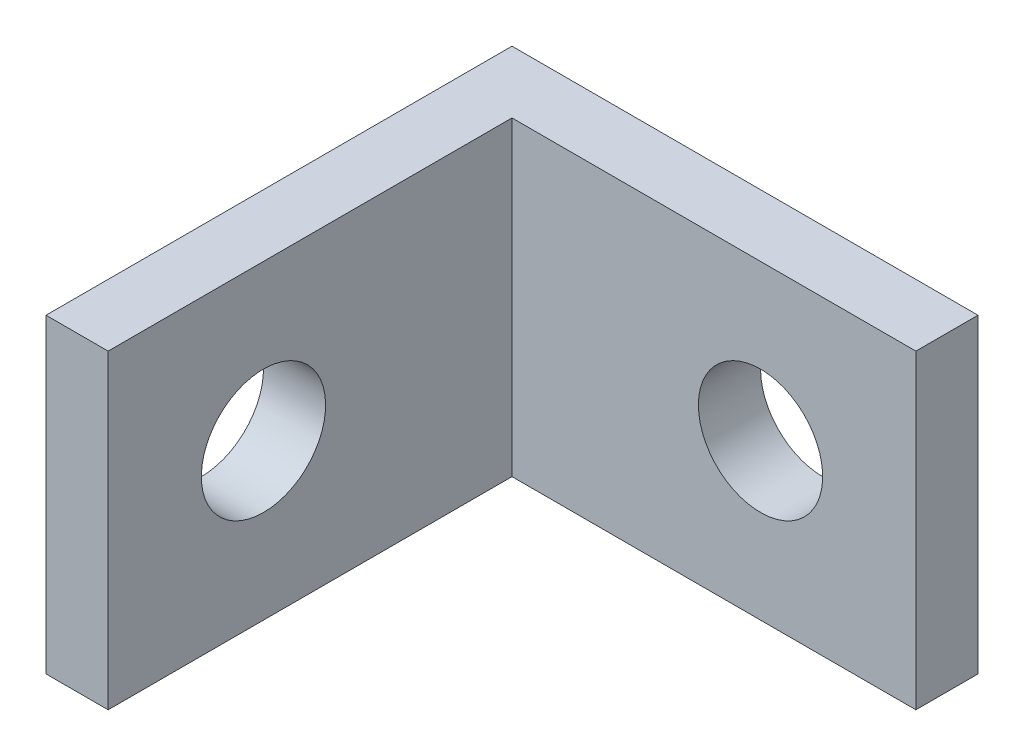
ISO-10303-21;
HEADER;
FILE_DESCRIPTION(('STEP AP214'),'2;1');
FILE_NAME('part.step','',(''),(''),'','','');
FILE_SCHEMA(('AUTOMOTIVE_DESIGN { 1 0 10303 214 1 1 1 1 }'));
ENDSEC;
DATA;
#1=APPLICATION_CONTEXT('core data for automotive mechanical design processes');
#2=APPLICATION_PROTOCOL_DEFINITION('international standard','automotive_design',2000,#1);
#3=PRODUCT_CONTEXT('',#1,'mechanical');
#4=PRODUCT('Part','Part','',(#3));
#5=PRODUCT_RELATED_PRODUCT_CATEGORY('part','',(#4));
#6=PRODUCT_DEFINITION_FORMATION('','',#4);
#7=PRODUCT_DEFINITION_CONTEXT('part definition',#1,'design');
#8=PRODUCT_DEFINITION('design','',#6,#7);
#9=PRODUCT_DEFINITION_SHAPE('','',#8);
#10=(LENGTH_UNIT() NAMED_UNIT(*) SI_UNIT(.MILLI.,.METRE.));
#11=(NAMED_UNIT(*) PLANE_ANGLE_UNIT() SI_UNIT($,.RADIAN.));
#12=(NAMED_UNIT(*) SI_UNIT($,.STERADIAN.) SOLID_ANGLE_UNIT());
#13=UNCERTAINTY_MEASURE_WITH_UNIT(LENGTH_MEASURE(1.E-05),#10,'distance_accuracy_value','');
#14=(GEOMETRIC_REPRESENTATION_CONTEXT(3) GLOBAL_UNCERTAINTY_ASSIGNED_CONTEXT((#13)) GLOBAL_UNIT_ASSIGNED_CONTEXT((#10,
#11,#12)) REPRESENTATION_CONTEXT('',''));
#15=CARTESIAN_POINT('',(0.,0.,0.));
#16=DIRECTION('',(0.,0.,1.));
#17=DIRECTION('',(1.,0.,0.));
#18=AXIS2_PLACEMENT_3D('',#15,#16,#17);
#19=CARTESIAN_POINT('',(7.5,5.,2.));
#20=DIRECTION('',(-1.,0.,0.));
#21=DIRECTION('',(0.,-1.,0.));
#22=AXIS2_PLACEMENT_3D('',#19,#20,#21);
#23=PLANE('',#22);
#24=DIRECTION('',(0.,1.,0.));
#25=VECTOR('',#24,1.);
#26=CARTESIAN_POINT('',(7.5,5.,0.));
#27=LINE('',#26,#25);
#28=CARTESIAN_POINT('',(7.5,-5.,0.));
#29=VERTEX_POINT('',#28);
#30=CARTESIAN_POINT('',(7.5,5.,0.));
#31=VERTEX_POINT('',#30);
#32=EDGE_CURVE('E91',#29,#31,#27,.T.);
#33=ORIENTED_EDGE('',*,*,#32,.T.);
#34=DIRECTION('',(0.,0.,-1.));
#35=VECTOR('',#34,1.);
#36=CARTESIAN_POINT('',(7.5,5.,2.));
#37=LINE('',#36,#35);
#38=CARTESIAN_POINT('',(7.5,5.,2.));
#39=VERTEX_POINT('',#38);
#40=EDGE_CURVE('E11',#39,#31,#37,.T.);
#41=ORIENTED_EDGE('',*,*,#40,.F.);
#42=DIRECTION('',(0.,1.,0.));
#43=VECTOR('',#42,1.);
#44=CARTESIAN_POINT('',(7.5,5.,2.));
#45=LINE('',#44,#43);
#46=CARTESIAN_POINT('',(7.5,-5.,2.));
#47=VERTEX_POINT('',#46);
#48=EDGE_CURVE('E85',#47,#39,#45,.T.);
#49=ORIENTED_EDGE('',*,*,#48,.F.);
#50=DIRECTION('',(0.,0.,-1.));
#51=VECTOR('',#50,1.);
#52=CARTESIAN_POINT('',(7.5,-5.,2.));
#53=LINE('',#52,#51);
#54=EDGE_CURVE('E77',#47,#29,#53,.T.);
#55=ORIENTED_EDGE('',*,*,#54,.T.);
#56=EDGE_LOOP('',(#33,#41,#49,#55));
#57=FACE_BOUND('',#56,.T.);
#58=ADVANCED_FACE('F34',(#57),#23,.F.);
#59=CARTESIAN_POINT('',(-7.5,5.,2.));
#60=DIRECTION('',(0.,-1.,0.));
#61=DIRECTION('',(0.,0.,-1.));
#62=AXIS2_PLACEMENT_3D('',#59,#60,#61);
#63=PLANE('',#62);
#64=DIRECTION('',(-1.,0.,0.));
#65=VECTOR('',#64,1.);
#66=CARTESIAN_POINT('',(-7.5,5.,0.));
#67=LINE('',#66,#65);
#68=CARTESIAN_POINT('',(-7.5,5.,0.));
#69=VERTEX_POINT('',#68);
#70=EDGE_CURVE('E94',#31,#69,#67,.T.);
#71=ORIENTED_EDGE('',*,*,#70,.T.);
#72=DIRECTION('',(0.,0.,-1.));
#73=VECTOR('',#72,1.);
#74=CARTESIAN_POINT('',(-7.5,5.,2.));
#75=LINE('',#74,#73);
#76=CARTESIAN_POINT('',(-7.5,5.,15.));
#77=VERTEX_POINT('',#76);
#78=EDGE_CURVE('E42',#77,#69,#75,.T.);
#79=ORIENTED_EDGE('',*,*,#78,.F.);
#80=DIRECTION('',(-1.,0.,0.));
#81=VECTOR('',#80,1.);
#82=CARTESIAN_POINT('',(-7.5,5.,15.));
#83=LINE('',#82,#81);
#84=CARTESIAN_POINT('',(-5.5,5.,15.));
#85=VERTEX_POINT('',#84);
#86=EDGE_CURVE('E119',#85,#77,#83,.T.);
#87=ORIENTED_EDGE('',*,*,#86,.F.);
#88=DIRECTION('',(0.,0.,-1.));
#89=VECTOR('',#88,1.);
#90=CARTESIAN_POINT('',(-5.5,5.,15.));
#91=LINE('',#90,#89);
#92=CARTESIAN_POINT('',(-5.5,5.,2.));
#93=VERTEX_POINT('',#92);
#94=EDGE_CURVE('E99',#85,#93,#91,.T.);
#95=ORIENTED_EDGE('',*,*,#94,.T.);
#96=DIRECTION('',(-1.,0.,0.));
#97=VECTOR('',#96,1.);
#98=CARTESIAN_POINT('',(-7.5,5.,2.));
#99=LINE('',#98,#97);
#100=EDGE_CURVE('E137',#39,#93,#99,.T.);
#101=ORIENTED_EDGE('',*,*,#100,.F.);
#102=ORIENTED_EDGE('',*,*,#40,.T.);
#103=EDGE_LOOP('',(#71,#79,#87,#95,#101,#102));
#104=FACE_BOUND('',#103,.T.);
#105=ADVANCED_FACE('F116',(#104),#63,.F.);
#106=CARTESIAN_POINT('',(-7.5,5.,2.));
#107=DIRECTION('',(1.,0.,0.));
#108=DIRECTION('',(0.,1.,0.));
#109=AXIS2_PLACEMENT_3D('',#106,#107,#108);
#110=PLANE('',#109);
#111=CARTESIAN_POINT('',(-7.5,0.,10.));
#112=DIRECTION('',(-1.,0.,0.));
#113=DIRECTION('',(0.,-1.,0.));
#114=AXIS2_PLACEMENT_3D('',#111,#112,#113);
#115=CIRCLE('',#114,2.);
#116=CARTESIAN_POINT('',(-7.5,-2.,10.));
#117=VERTEX_POINT('',#116);
#118=EDGE_CURVE('E154',#117,#117,#115,.T.);
#119=ORIENTED_EDGE('',*,*,#118,.F.);
#120=EDGE_LOOP('',(#119));
#121=FACE_BOUND('',#120,.T.);
#122=DIRECTION('',(0.,-1.,0.));
#123=VECTOR('',#122,1.);
#124=CARTESIAN_POINT('',(-7.5,5.,0.));
#125=LINE('',#124,#123);
#126=CARTESIAN_POINT('',(-7.5,-5.,0.));
#127=VERTEX_POINT('',#126);
#128=EDGE_CURVE('E86',#69,#127,#125,.T.);
#129=ORIENTED_EDGE('',*,*,#128,.T.);
#130=DIRECTION('',(0.,0.,-1.));
#131=VECTOR('',#130,1.);
#132=CARTESIAN_POINT('',(-7.5,-5.,2.));
#133=LINE('',#132,#131);
#134=CARTESIAN_POINT('',(-7.5,-5.,15.));
#135=VERTEX_POINT('',#134);
#136=EDGE_CURVE('E81',#135,#127,#133,.T.);
#137=ORIENTED_EDGE('',*,*,#136,.F.);
#138=DIRECTION('',(0.,-1.,0.));
#139=VECTOR('',#138,1.);
#140=CARTESIAN_POINT('',(-7.5,5.,15.));
#141=LINE('',#140,#139);
#142=EDGE_CURVE('E112',#77,#135,#141,.T.);
#143=ORIENTED_EDGE('',*,*,#142,.F.);
#144=ORIENTED_EDGE('',*,*,#78,.T.);
#145=EDGE_LOOP('',(#129,#137,#143,#144));
#146=FACE_BOUND('',#145,.T.);
#147=ADVANCED_FACE('F110',(#121,#146),#110,.F.);
#148=CARTESIAN_POINT('',(-7.5,-5.,2.));
#149=DIRECTION('',(0.,1.,0.));
#150=DIRECTION('',(0.,0.,1.));
#151=AXIS2_PLACEMENT_3D('',#148,#149,#150);
#152=PLANE('',#151);
#153=DIRECTION('',(1.,0.,0.));
#154=VECTOR('',#153,1.);
#155=CARTESIAN_POINT('',(-7.5,-5.,0.));
#156=LINE('',#155,#154);
#157=EDGE_CURVE('E74',#127,#29,#156,.T.);
#158=ORIENTED_EDGE('',*,*,#157,.T.);
#159=ORIENTED_EDGE('',*,*,#54,.F.);
#160=DIRECTION('',(1.,0.,0.));
#161=VECTOR('',#160,1.);
#162=CARTESIAN_POINT('',(-7.5,-5.,2.));
#163=LINE('',#162,#161);
#164=CARTESIAN_POINT('',(-5.5,-5.,2.));
#165=VERTEX_POINT('',#164);
#166=EDGE_CURVE('E54',#165,#47,#163,.T.);
#167=ORIENTED_EDGE('',*,*,#166,.F.);
#168=DIRECTION('',(0.,0.,-1.));
#169=VECTOR('',#168,1.);
#170=CARTESIAN_POINT('',(-5.5,-5.,15.));
#171=LINE('',#170,#169);
#172=CARTESIAN_POINT('',(-5.5,-5.,15.));
#173=VERTEX_POINT('',#172);
#174=EDGE_CURVE('E95',#173,#165,#171,.T.);
#175=ORIENTED_EDGE('',*,*,#174,.F.);
#176=DIRECTION('',(1.,0.,0.));
#177=VECTOR('',#176,1.);
#178=CARTESIAN_POINT('',(-7.5,-5.,15.));
#179=LINE('',#178,#177);
#180=EDGE_CURVE('E131',#135,#173,#179,.T.);
#181=ORIENTED_EDGE('',*,*,#180,.F.);
#182=ORIENTED_EDGE('',*,*,#136,.T.);
#183=EDGE_LOOP('',(#158,#159,#167,#175,#181,#182));
#184=FACE_BOUND('',#183,.T.);
#185=ADVANCED_FACE('F76',(#184),#152,.F.);
#186=CARTESIAN_POINT('',(0.,0.,2.));
#187=DIRECTION('',(0.,0.,1.));
#188=DIRECTION('',(1.,0.,0.));
#189=AXIS2_PLACEMENT_3D('',#186,#187,#188);
#190=PLANE('',#189);
#191=CARTESIAN_POINT('',(2.5,0.,2.));
#192=DIRECTION('',(0.,0.,1.));
#193=DIRECTION('',(1.,0.,0.));
#194=AXIS2_PLACEMENT_3D('',#191,#192,#193);
#195=CIRCLE('',#194,2.);
#196=CARTESIAN_POINT('',(0.500000000000002,0.,2.));
#197=VERTEX_POINT('',#196);
#198=EDGE_CURVE('E135',#197,#197,#195,.T.);
#199=ORIENTED_EDGE('',*,*,#198,.F.);
#200=EDGE_LOOP('',(#199));
#201=FACE_BOUND('',#200,.T.);
#202=DIRECTION('',(0.,1.,0.));
#203=VECTOR('',#202,1.);
#204=CARTESIAN_POINT('',(-5.5,5.,2.));
#205=LINE('',#204,#203);
#206=EDGE_CURVE('E49',#165,#93,#205,.T.);
#207=ORIENTED_EDGE('',*,*,#206,.F.);
#208=ORIENTED_EDGE('',*,*,#166,.T.);
#209=ORIENTED_EDGE('',*,*,#48,.T.);
#210=ORIENTED_EDGE('',*,*,#100,.T.);
#211=EDGE_LOOP('',(#207,#208,#209,#210));
#212=FACE_BOUND('',#211,.T.);
#213=ADVANCED_FACE('F139',(#201,#212),#190,.T.);
#214=CARTESIAN_POINT('',(0.,0.,0.));
#215=DIRECTION('',(0.,0.,1.));
#216=DIRECTION('',(1.,0.,0.));
#217=AXIS2_PLACEMENT_3D('',#214,#215,#216);
#218=PLANE('',#217);
#219=CARTESIAN_POINT('',(2.5,0.,0.));
#220=DIRECTION('',(0.,0.,-1.));
#221=DIRECTION('',(-1.,0.,0.));
#222=AXIS2_PLACEMENT_3D('',#219,#220,#221);
#223=CIRCLE('',#222,2.);
#224=CARTESIAN_POINT('',(0.500000000000002,0.,0.));
#225=VERTEX_POINT('',#224);
#226=EDGE_CURVE('E151',#225,#225,#223,.T.);
#227=ORIENTED_EDGE('',*,*,#226,.F.);
#228=EDGE_LOOP('',(#227));
#229=FACE_BOUND('',#228,.T.);
#230=ORIENTED_EDGE('',*,*,#32,.F.);
#231=ORIENTED_EDGE('',*,*,#157,.F.);
#232=ORIENTED_EDGE('',*,*,#128,.F.);
#233=ORIENTED_EDGE('',*,*,#70,.F.);
#234=EDGE_LOOP('',(#230,#231,#232,#233));
#235=FACE_BOUND('',#234,.T.);
#236=ADVANCED_FACE('F93',(#229,#235),#218,.F.);
#237=CARTESIAN_POINT('',(-5.5,5.,15.));
#238=DIRECTION('',(-1.,0.,0.));
#239=DIRECTION('',(0.,-1.,0.));
#240=AXIS2_PLACEMENT_3D('',#237,#238,#239);
#241=PLANE('',#240);
#242=CARTESIAN_POINT('',(-5.5,0.,10.));
#243=DIRECTION('',(-1.,0.,0.));
#244=DIRECTION('',(0.,-1.,0.));
#245=AXIS2_PLACEMENT_3D('',#242,#243,#244);
#246=CIRCLE('',#245,2.);
#247=CARTESIAN_POINT('',(-5.5,-2.,10.));
#248=VERTEX_POINT('',#247);
#249=EDGE_CURVE('E37',#248,#248,#246,.T.);
#250=ORIENTED_EDGE('',*,*,#249,.T.);
#251=EDGE_LOOP('',(#250));
#252=FACE_BOUND('',#251,.T.);
#253=ORIENTED_EDGE('',*,*,#206,.T.);
#254=ORIENTED_EDGE('',*,*,#94,.F.);
#255=DIRECTION('',(0.,1.,0.));
#256=VECTOR('',#255,1.);
#257=CARTESIAN_POINT('',(-5.5,5.,15.));
#258=LINE('',#257,#256);
#259=EDGE_CURVE('E127',#173,#85,#258,.T.);
#260=ORIENTED_EDGE('',*,*,#259,.F.);
#261=ORIENTED_EDGE('',*,*,#174,.T.);
#262=EDGE_LOOP('',(#253,#254,#260,#261));
#263=FACE_BOUND('',#262,.T.);
#264=ADVANCED_FACE('F141',(#252,#263),#241,.F.);
#265=CARTESIAN_POINT('',(0.,0.,15.));
#266=DIRECTION('',(0.,0.,1.));
#267=DIRECTION('',(1.,0.,0.));
#268=AXIS2_PLACEMENT_3D('',#265,#266,#267);
#269=PLANE('',#268);
#270=ORIENTED_EDGE('',*,*,#142,.T.);
#271=ORIENTED_EDGE('',*,*,#180,.T.);
#272=ORIENTED_EDGE('',*,*,#259,.T.);
#273=ORIENTED_EDGE('',*,*,#86,.T.);
#274=EDGE_LOOP('',(#270,#271,#272,#273));
#275=FACE_BOUND('',#274,.T.);
#276=ADVANCED_FACE('F123',(#275),#269,.T.);
#277=CARTESIAN_POINT('',(2.5,0.,13.));
#278=DIRECTION('',(0.,0.,-1.));
#279=DIRECTION('',(-1.,0.,0.));
#280=AXIS2_PLACEMENT_3D('',#277,#278,#279);
#281=CYLINDRICAL_SURFACE('',#280,2.);
#282=CARTESIAN_POINT('',(0.500000000000002,0.,2.));
#283=CARTESIAN_POINT('',(0.500000000000002,0.,1.97916666666667));
#284=CARTESIAN_POINT('',(0.500000000000002,0.,1.95833333333333));
#285=CARTESIAN_POINT('',(0.500000000000002,0.,1.91666666666666));
#286=CARTESIAN_POINT('',(0.500000000000002,0.,1.89583333333333));
#287=CARTESIAN_POINT('',(0.500000000000002,0.,1.85416666666666));
#288=CARTESIAN_POINT('',(0.500000000000002,0.,1.83333333333333));
#289=CARTESIAN_POINT('',(0.500000000000002,0.,1.79166666666666));
#290=CARTESIAN_POINT('',(0.500000000000002,0.,1.77083333333333));
#291=CARTESIAN_POINT('',(0.500000000000002,0.,1.72916666666666));
#292=CARTESIAN_POINT('',(0.500000000000002,0.,1.70833333333333));
#293=CARTESIAN_POINT('',(0.500000000000002,0.,1.66666666666666));
#294=CARTESIAN_POINT('',(0.500000000000002,0.,1.64583333333333));
#295=CARTESIAN_POINT('',(0.500000000000002,0.,1.60416666666666));
#296=CARTESIAN_POINT('',(0.500000000000002,0.,1.58333333333333));
#297=CARTESIAN_POINT('',(0.500000000000002,0.,1.54166666666666));
#298=CARTESIAN_POINT('',(0.500000000000002,0.,1.52083333333333));
#299=CARTESIAN_POINT('',(0.500000000000002,0.,1.47916666666667));
#300=CARTESIAN_POINT('',(0.500000000000002,0.,1.45833333333333));
#301=CARTESIAN_POINT('',(0.500000000000002,0.,1.41666666666667));
#302=CARTESIAN_POINT('',(0.500000000000002,0.,1.39583333333333));
#303=CARTESIAN_POINT('',(0.500000000000002,0.,1.35416666666667));
#304=CARTESIAN_POINT('',(0.500000000000002,0.,1.33333333333333));
#305=CARTESIAN_POINT('',(0.500000000000002,0.,1.29166666666667));
#306=CARTESIAN_POINT('',(0.500000000000002,0.,1.27083333333333));
#307=CARTESIAN_POINT('',(0.500000000000002,0.,1.22916666666667));
#308=CARTESIAN_POINT('',(0.500000000000002,0.,1.20833333333333));
#309=CARTESIAN_POINT('',(0.500000000000002,0.,1.16666666666667));
#310=CARTESIAN_POINT('',(0.500000000000002,0.,1.14583333333333));
#311=CARTESIAN_POINT('',(0.500000000000002,0.,1.10416666666667));
#312=CARTESIAN_POINT('',(0.500000000000002,0.,1.08333333333333));
#313=CARTESIAN_POINT('',(0.500000000000002,0.,1.04166666666667));
#314=CARTESIAN_POINT('',(0.500000000000002,0.,1.02083333333333));
#315=CARTESIAN_POINT('',(0.500000000000002,0.,0.979166666666666));
#316=CARTESIAN_POINT('',(0.500000000000002,0.,0.958333333333332));
#317=CARTESIAN_POINT('',(0.500000000000002,0.,0.916666666666666));
#318=CARTESIAN_POINT('',(0.500000000000002,0.,0.895833333333332));
#319=CARTESIAN_POINT('',(0.500000000000002,0.,0.854166666666666));
#320=CARTESIAN_POINT('',(0.500000000000002,0.,0.833333333333332));
#321=CARTESIAN_POINT('',(0.500000000000002,0.,0.791666666666666));
#322=CARTESIAN_POINT('',(0.500000000000002,0.,0.770833333333332));
#323=CARTESIAN_POINT('',(0.500000000000002,0.,0.729166666666666));
#324=CARTESIAN_POINT('',(0.500000000000002,0.,0.708333333333332));
#325=CARTESIAN_POINT('',(0.500000000000002,0.,0.666666666666666));
#326=CARTESIAN_POINT('',(0.500000000000002,0.,0.645833333333332));
#327=CARTESIAN_POINT('',(0.500000000000002,0.,0.604166666666666));
#328=CARTESIAN_POINT('',(0.500000000000002,0.,0.583333333333333));
#329=CARTESIAN_POINT('',(0.500000000000002,0.,0.541666666666667));
#330=CARTESIAN_POINT('',(0.500000000000002,0.,0.520833333333334));
#331=CARTESIAN_POINT('',(0.500000000000002,0.,0.479166666666667));
#332=CARTESIAN_POINT('',(0.500000000000002,0.,0.458333333333334));
#333=CARTESIAN_POINT('',(0.500000000000002,0.,0.416666666666667));
#334=CARTESIAN_POINT('',(0.500000000000002,0.,0.395833333333334));
#335=CARTESIAN_POINT('',(0.500000000000002,0.,0.354166666666667));
#336=CARTESIAN_POINT('',(0.500000000000002,0.,0.333333333333334));
#337=CARTESIAN_POINT('',(0.500000000000002,0.,0.291666666666667));
#338=CARTESIAN_POINT('',(0.500000000000002,0.,0.270833333333334));
#339=CARTESIAN_POINT('',(0.500000000000002,0.,0.229166666666667));
#340=CARTESIAN_POINT('',(0.500000000000002,0.,0.208333333333334));
#341=CARTESIAN_POINT('',(0.500000000000002,0.,0.166666666666667));
#342=CARTESIAN_POINT('',(0.500000000000002,0.,0.145833333333333));
#343=CARTESIAN_POINT('',(0.500000000000002,0.,0.104166666666667));
#344=CARTESIAN_POINT('',(0.500000000000002,0.,0.0833333333333334));
#345=CARTESIAN_POINT('',(0.500000000000002,0.,0.0416666666666667));
#346=CARTESIAN_POINT('',(0.500000000000002,0.,0.0208333333333333));
#347=CARTESIAN_POINT('',(0.500000000000002,0.,0.));
#348=B_SPLINE_CURVE_WITH_KNOTS('',3,(#282,#283,#284,#285,#286,#287,#288,#289,#290,#291,#292,
#293,#294,#295,#296,#297,#298,#299,#300,#301,#302,#303,#304,#305,#306,#307,#308,#309,#310,#311,
#312,#313,#314,#315,#316,#317,#318,#319,#320,#321,#322,#323,#324,#325,#326,#327,#328,#329,#330,
#331,#332,#333,#334,#335,#336,#337,#338,#339,#340,#341,#342,#343,#344,#345,#346,#347),
.UNSPECIFIED.,.F.,.F.,(4,2,2,2,2,2,2,2,2,2,2,2,2,2,2,2,2,2,2,2,2,2,2,2,2,2,2,2,2,2,2,2,4),(0.,
0.0625000000000001,0.125,0.1875,0.25,0.3125,0.375,0.4375,0.5,0.562499999999999,
0.624999999999999,0.687499999999999,0.749999999999999,0.812499999999999,0.874999999999999,
0.937499999999999,0.999999999999999,1.0625,1.125,1.1875,1.25,1.3125,1.375,1.4375,1.5,1.5625,
1.625,1.6875,1.75,1.8125,1.875,1.9375,2.),.UNSPECIFIED.);
#349=EDGE_CURVE('BSEAM164',#197,#225,#348,.T.);
#350=ORIENTED_EDGE('',*,*,#198,.T.);
#351=ORIENTED_EDGE('',*,*,#226,.T.);
#352=ORIENTED_EDGE('',*,*,#349,.T.);
#353=ORIENTED_EDGE('',*,*,#349,.F.);
#354=EDGE_LOOP('',(#350,#352,#351,#353));
#355=FACE_BOUND('',#354,.T.);
#356=ADVANCED_FACE('F164',(#355),#281,.F.);
#357=CARTESIAN_POINT('',(5.5,0.,10.));
#358=DIRECTION('',(-1.,0.,0.));
#359=DIRECTION('',(0.,-1.,0.));
#360=AXIS2_PLACEMENT_3D('',#357,#358,#359);
#361=CYLINDRICAL_SURFACE('',#360,2.);
#362=CARTESIAN_POINT('',(-7.5,-2.,10.));
#363=CARTESIAN_POINT('',(-7.47916666666666,-2.,10.));
#364=CARTESIAN_POINT('',(-7.45833333333333,-2.,10.));
#365=CARTESIAN_POINT('',(-7.41666666666666,-2.,10.));
#366=CARTESIAN_POINT('',(-7.39583333333333,-2.,10.));
#367=CARTESIAN_POINT('',(-7.35416666666666,-2.,10.));
#368=CARTESIAN_POINT('',(-7.33333333333333,-2.,10.));
#369=CARTESIAN_POINT('',(-7.29166666666666,-2.,10.));
#370=CARTESIAN_POINT('',(-7.27083333333333,-2.,10.));
#371=CARTESIAN_POINT('',(-7.22916666666666,-2.,10.));
#372=CARTESIAN_POINT('',(-7.20833333333333,-2.,10.));
#373=CARTESIAN_POINT('',(-7.16666666666666,-2.,10.));
#374=CARTESIAN_POINT('',(-7.14583333333333,-2.,10.));
#375=CARTESIAN_POINT('',(-7.10416666666666,-2.,10.));
#376=CARTESIAN_POINT('',(-7.08333333333333,-2.,10.));
#377=CARTESIAN_POINT('',(-7.04166666666666,-2.,10.));
#378=CARTESIAN_POINT('',(-7.02083333333333,-2.,10.));
#379=CARTESIAN_POINT('',(-6.97916666666666,-2.,10.));
#380=CARTESIAN_POINT('',(-6.95833333333333,-2.,10.));
#381=CARTESIAN_POINT('',(-6.91666666666666,-2.,10.));
#382=CARTESIAN_POINT('',(-6.89583333333333,-2.,10.));
#383=CARTESIAN_POINT('',(-6.85416666666666,-2.,10.));
#384=CARTESIAN_POINT('',(-6.83333333333333,-2.,10.));
#385=CARTESIAN_POINT('',(-6.79166666666666,-2.,10.));
#386=CARTESIAN_POINT('',(-6.77083333333333,-2.,10.));
#387=CARTESIAN_POINT('',(-6.72916666666666,-2.,10.));
#388=CARTESIAN_POINT('',(-6.70833333333333,-2.,10.));
#389=CARTESIAN_POINT('',(-6.66666666666666,-2.,10.));
#390=CARTESIAN_POINT('',(-6.64583333333333,-2.,10.));
#391=CARTESIAN_POINT('',(-6.60416666666666,-2.,10.));
#392=CARTESIAN_POINT('',(-6.58333333333333,-2.,10.));
#393=CARTESIAN_POINT('',(-6.54166666666666,-2.,10.));
#394=CARTESIAN_POINT('',(-6.52083333333333,-2.,10.));
#395=CARTESIAN_POINT('',(-6.47916666666666,-2.,10.));
#396=CARTESIAN_POINT('',(-6.45833333333333,-2.,10.));
#397=CARTESIAN_POINT('',(-6.41666666666666,-2.,10.));
#398=CARTESIAN_POINT('',(-6.39583333333333,-2.,10.));
#399=CARTESIAN_POINT('',(-6.35416666666666,-2.,10.));
#400=CARTESIAN_POINT('',(-6.33333333333333,-2.,10.));
#401=CARTESIAN_POINT('',(-6.29166666666666,-2.,10.));
#402=CARTESIAN_POINT('',(-6.27083333333333,-2.,10.));
#403=CARTESIAN_POINT('',(-6.22916666666666,-2.,10.));
#404=CARTESIAN_POINT('',(-6.20833333333333,-2.,10.));
#405=CARTESIAN_POINT('',(-6.16666666666666,-2.,10.));
#406=CARTESIAN_POINT('',(-6.14583333333333,-2.,10.));
#407=CARTESIAN_POINT('',(-6.10416666666666,-2.,10.));
#408=CARTESIAN_POINT('',(-6.08333333333333,-2.,10.));
#409=CARTESIAN_POINT('',(-6.04166666666666,-2.,10.));
#410=CARTESIAN_POINT('',(-6.02083333333333,-2.,10.));
#411=CARTESIAN_POINT('',(-5.97916666666666,-2.,10.));
#412=CARTESIAN_POINT('',(-5.95833333333333,-2.,10.));
#413=CARTESIAN_POINT('',(-5.91666666666666,-2.,10.));
#414=CARTESIAN_POINT('',(-5.89583333333333,-2.,10.));
#415=CARTESIAN_POINT('',(-5.85416666666666,-2.,10.));
#416=CARTESIAN_POINT('',(-5.83333333333333,-2.,10.));
#417=CARTESIAN_POINT('',(-5.79166666666666,-2.,10.));
#418=CARTESIAN_POINT('',(-5.77083333333333,-2.,10.));
#419=CARTESIAN_POINT('',(-5.72916666666666,-2.,10.));
#420=CARTESIAN_POINT('',(-5.70833333333333,-2.,10.));
#421=CARTESIAN_POINT('',(-5.66666666666666,-2.,10.));
#422=CARTESIAN_POINT('',(-5.64583333333333,-2.,10.));
#423=CARTESIAN_POINT('',(-5.60416666666666,-2.,10.));
#424=CARTESIAN_POINT('',(-5.58333333333333,-2.,10.));
#425=CARTESIAN_POINT('',(-5.54166666666666,-2.,10.));
#426=CARTESIAN_POINT('',(-5.52083333333333,-2.,10.));
#427=CARTESIAN_POINT('',(-5.5,-2.,10.));
#428=B_SPLINE_CURVE_WITH_KNOTS('',3,(#362,#363,#364,#365,#366,#367,#368,#369,#370,#371,#372,
#373,#374,#375,#376,#377,#378,#379,#380,#381,#382,#383,#384,#385,#386,#387,#388,#389,#390,#391,
#392,#393,#394,#395,#396,#397,#398,#399,#400,#401,#402,#403,#404,#405,#406,#407,#408,#409,#410,
#411,#412,#413,#414,#415,#416,#417,#418,#419,#420,#421,#422,#423,#424,#425,#426,#427),
.UNSPECIFIED.,.F.,.F.,(4,2,2,2,2,2,2,2,2,2,2,2,2,2,2,2,2,2,2,2,2,2,2,2,2,2,2,2,2,2,2,2,4),(0.,
0.0625000000000001,0.125,0.1875,0.25,0.3125,0.375,0.4375,0.5,0.5625,0.625000000000001,
0.687500000000001,0.750000000000001,0.812500000000001,0.875000000000001,0.937500000000001,1.,
1.0625,1.125,1.1875,1.25,1.3125,1.375,1.4375,1.5,1.5625,1.625,1.6875,1.75,1.8125,1.875,1.9375,
2.),.UNSPECIFIED.);
#429=EDGE_CURVE('BSEAM162',#117,#248,#428,.T.);
#430=ORIENTED_EDGE('',*,*,#118,.T.);
#431=ORIENTED_EDGE('',*,*,#249,.F.);
#432=ORIENTED_EDGE('',*,*,#429,.T.);
#433=ORIENTED_EDGE('',*,*,#429,.F.);
#434=EDGE_LOOP('',(#430,#432,#431,#433));
#435=FACE_BOUND('',#434,.T.);
#436=ADVANCED_FACE('F162',(#435),#361,.F.);
#437=CLOSED_SHELL('',(#58,#105,#147,#185,#213,#236,#264,#276,#356,#436));
#438=MANIFOLD_SOLID_BREP('B2',#437);
#439=ADVANCED_BREP_SHAPE_REPRESENTATION('',(#18,#438),#14);
#440=SHAPE_DEFINITION_REPRESENTATION(#9,#439);
ENDSEC;
END-ISO-10303-21;
